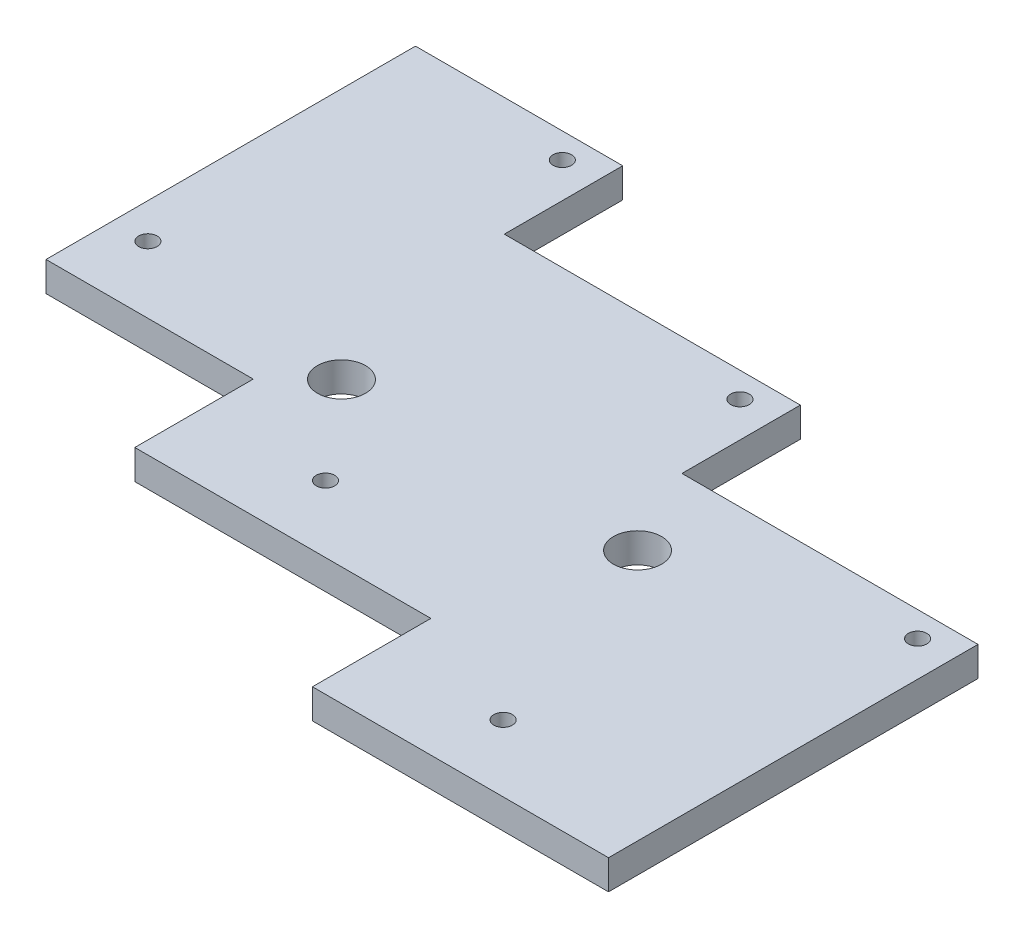
ISO-10303-21;
HEADER;
FILE_DESCRIPTION(('STEP AP214'),'2;1');
FILE_NAME('part.step','',(''),(''),'','','');
FILE_SCHEMA(('AUTOMOTIVE_DESIGN { 1 0 10303 214 1 1 1 1 }'));
ENDSEC;
DATA;
#1=APPLICATION_CONTEXT('core data for automotive mechanical design processes');
#2=APPLICATION_PROTOCOL_DEFINITION('international standard','automotive_design',2000,#1);
#3=PRODUCT_CONTEXT('',#1,'mechanical');
#4=PRODUCT('Part','Part','',(#3));
#5=PRODUCT_RELATED_PRODUCT_CATEGORY('part','',(#4));
#6=PRODUCT_DEFINITION_FORMATION('','',#4);
#7=PRODUCT_DEFINITION_CONTEXT('part definition',#1,'design');
#8=PRODUCT_DEFINITION('design','',#6,#7);
#9=PRODUCT_DEFINITION_SHAPE('','',#8);
#10=(LENGTH_UNIT() NAMED_UNIT(*) SI_UNIT(.MILLI.,.METRE.));
#11=(NAMED_UNIT(*) PLANE_ANGLE_UNIT() SI_UNIT($,.RADIAN.));
#12=(NAMED_UNIT(*) SI_UNIT($,.STERADIAN.) SOLID_ANGLE_UNIT());
#13=UNCERTAINTY_MEASURE_WITH_UNIT(LENGTH_MEASURE(1.E-05),#10,'distance_accuracy_value','');
#14=(GEOMETRIC_REPRESENTATION_CONTEXT(3) GLOBAL_UNCERTAINTY_ASSIGNED_CONTEXT((#13)) GLOBAL_UNIT_ASSIGNED_CONTEXT((#10,
#11,#12)) REPRESENTATION_CONTEXT('',''));
#15=CARTESIAN_POINT('',(0.,0.,0.));
#16=DIRECTION('',(0.,0.,1.));
#17=DIRECTION('',(1.,0.,0.));
#18=AXIS2_PLACEMENT_3D('',#15,#16,#17);
#19=CARTESIAN_POINT('',(-85.725,3.175,-65.024));
#20=DIRECTION('',(1.,0.,0.));
#21=DIRECTION('',(0.,0.,-1.));
#22=AXIS2_PLACEMENT_3D('',#19,#20,#21);
#23=PLANE('',#22);
#24=DIRECTION('',(0.,0.,1.));
#25=VECTOR('',#24,1.);
#26=CARTESIAN_POINT('',(-85.725,-3.175,-65.024));
#27=LINE('',#26,#25);
#28=CARTESIAN_POINT('',(-85.725,-3.175,-65.024));
#29=VERTEX_POINT('',#28);
#30=CARTESIAN_POINT('',(-85.725,-3.175,14.224));
#31=VERTEX_POINT('',#30);
#32=EDGE_CURVE('E165',#29,#31,#27,.T.);
#33=ORIENTED_EDGE('',*,*,#32,.T.);
#34=DIRECTION('',(0.,-1.,0.));
#35=VECTOR('',#34,1.);
#36=CARTESIAN_POINT('',(-85.725,3.175,14.224));
#37=LINE('',#36,#35);
#38=CARTESIAN_POINT('',(-85.725,3.175,14.224));
#39=VERTEX_POINT('',#38);
#40=EDGE_CURVE('E11',#39,#31,#37,.T.);
#41=ORIENTED_EDGE('',*,*,#40,.F.);
#42=DIRECTION('',(0.,0.,1.));
#43=VECTOR('',#42,1.);
#44=CARTESIAN_POINT('',(-85.725,3.175,-65.024));
#45=LINE('',#44,#43);
#46=CARTESIAN_POINT('',(-85.725,3.175,-65.024));
#47=VERTEX_POINT('',#46);
#48=EDGE_CURVE('E188',#47,#39,#45,.T.);
#49=ORIENTED_EDGE('',*,*,#48,.F.);
#50=DIRECTION('',(0.,-1.,0.));
#51=VECTOR('',#50,1.);
#52=CARTESIAN_POINT('',(-85.725,3.175,-65.024));
#53=LINE('',#52,#51);
#54=EDGE_CURVE('E161',#47,#29,#53,.T.);
#55=ORIENTED_EDGE('',*,*,#54,.T.);
#56=EDGE_LOOP('',(#33,#41,#49,#55));
#57=FACE_BOUND('',#56,.T.);
#58=ADVANCED_FACE('F45',(#57),#23,.F.);
#59=CARTESIAN_POINT('',(-85.725,3.175,14.224));
#60=DIRECTION('',(0.,0.,-1.));
#61=DIRECTION('',(-1.,0.,0.));
#62=AXIS2_PLACEMENT_3D('',#59,#60,#61);
#63=PLANE('',#62);
#64=DIRECTION('',(1.,0.,0.));
#65=VECTOR('',#64,1.);
#66=CARTESIAN_POINT('',(-85.725,-3.175,14.224));
#67=LINE('',#66,#65);
#68=CARTESIAN_POINT('',(-41.275,-3.175,14.224));
#69=VERTEX_POINT('',#68);
#70=EDGE_CURVE('E168',#31,#69,#67,.T.);
#71=ORIENTED_EDGE('',*,*,#70,.T.);
#72=DIRECTION('',(0.,-1.,0.));
#73=VECTOR('',#72,1.);
#74=CARTESIAN_POINT('',(-41.275,3.175,14.224));
#75=LINE('',#74,#73);
#76=CARTESIAN_POINT('',(-41.275,3.175,14.224));
#77=VERTEX_POINT('',#76);
#78=EDGE_CURVE('E53',#77,#69,#75,.T.);
#79=ORIENTED_EDGE('',*,*,#78,.F.);
#80=DIRECTION('',(1.,0.,0.));
#81=VECTOR('',#80,1.);
#82=CARTESIAN_POINT('',(-85.725,3.175,14.224));
#83=LINE('',#82,#81);
#84=EDGE_CURVE('E116',#39,#77,#83,.T.);
#85=ORIENTED_EDGE('',*,*,#84,.F.);
#86=ORIENTED_EDGE('',*,*,#40,.T.);
#87=EDGE_LOOP('',(#71,#79,#85,#86));
#88=FACE_BOUND('',#87,.T.);
#89=ADVANCED_FACE('F268',(#88),#63,.F.);
#90=CARTESIAN_POINT('',(-41.275,3.175,14.224));
#91=DIRECTION('',(1.,0.,0.));
#92=DIRECTION('',(0.,0.,-1.));
#93=AXIS2_PLACEMENT_3D('',#90,#91,#92);
#94=PLANE('',#93);
#95=DIRECTION('',(0.,0.,1.));
#96=VECTOR('',#95,1.);
#97=CARTESIAN_POINT('',(-41.275,-3.175,14.224));
#98=LINE('',#97,#96);
#99=CARTESIAN_POINT('',(-41.275,-3.175,39.624));
#100=VERTEX_POINT('',#99);
#101=EDGE_CURVE('E171',#69,#100,#98,.T.);
#102=ORIENTED_EDGE('',*,*,#101,.T.);
#103=DIRECTION('',(0.,-1.,0.));
#104=VECTOR('',#103,1.);
#105=CARTESIAN_POINT('',(-41.275,3.175,39.624));
#106=LINE('',#105,#104);
#107=CARTESIAN_POINT('',(-41.275,3.175,39.624));
#108=VERTEX_POINT('',#107);
#109=EDGE_CURVE('E207',#108,#100,#106,.T.);
#110=ORIENTED_EDGE('',*,*,#109,.F.);
#111=DIRECTION('',(0.,0.,1.));
#112=VECTOR('',#111,1.);
#113=CARTESIAN_POINT('',(-41.275,3.175,14.224));
#114=LINE('',#113,#112);
#115=EDGE_CURVE('E215',#77,#108,#114,.T.);
#116=ORIENTED_EDGE('',*,*,#115,.F.);
#117=ORIENTED_EDGE('',*,*,#78,.T.);
#118=EDGE_LOOP('',(#102,#110,#116,#117));
#119=FACE_BOUND('',#118,.T.);
#120=ADVANCED_FACE('F213',(#119),#94,.F.);
#121=CARTESIAN_POINT('',(-41.275,3.175,39.624));
#122=DIRECTION('',(0.,0.,-1.));
#123=DIRECTION('',(-1.,0.,0.));
#124=AXIS2_PLACEMENT_3D('',#121,#122,#123);
#125=PLANE('',#124);
#126=DIRECTION('',(1.,0.,0.));
#127=VECTOR('',#126,1.);
#128=CARTESIAN_POINT('',(-41.275,-3.175,39.624));
#129=LINE('',#128,#127);
#130=CARTESIAN_POINT('',(22.225,-3.175,39.624));
#131=VERTEX_POINT('',#130);
#132=EDGE_CURVE('E173',#100,#131,#129,.T.);
#133=ORIENTED_EDGE('',*,*,#132,.T.);
#134=DIRECTION('',(0.,-1.,0.));
#135=VECTOR('',#134,1.);
#136=CARTESIAN_POINT('',(22.225,3.175,39.624));
#137=LINE('',#136,#135);
#138=CARTESIAN_POINT('',(22.225,3.175,39.624));
#139=VERTEX_POINT('',#138);
#140=EDGE_CURVE('E204',#139,#131,#137,.T.);
#141=ORIENTED_EDGE('',*,*,#140,.F.);
#142=DIRECTION('',(1.,0.,0.));
#143=VECTOR('',#142,1.);
#144=CARTESIAN_POINT('',(-41.275,3.175,39.624));
#145=LINE('',#144,#143);
#146=EDGE_CURVE('E233',#108,#139,#145,.T.);
#147=ORIENTED_EDGE('',*,*,#146,.F.);
#148=ORIENTED_EDGE('',*,*,#109,.T.);
#149=EDGE_LOOP('',(#133,#141,#147,#148));
#150=FACE_BOUND('',#149,.T.);
#151=ADVANCED_FACE('F224',(#150),#125,.F.);
#152=CARTESIAN_POINT('',(22.225,3.175,39.624));
#153=DIRECTION('',(1.,0.,0.));
#154=DIRECTION('',(0.,0.,-1.));
#155=AXIS2_PLACEMENT_3D('',#152,#153,#154);
#156=PLANE('',#155);
#157=DIRECTION('',(0.,0.,1.));
#158=VECTOR('',#157,1.);
#159=CARTESIAN_POINT('',(22.225,-3.175,39.624));
#160=LINE('',#159,#158);
#161=CARTESIAN_POINT('',(22.225,-3.175,65.024));
#162=VERTEX_POINT('',#161);
#163=EDGE_CURVE('E175',#131,#162,#160,.T.);
#164=ORIENTED_EDGE('',*,*,#163,.T.);
#165=DIRECTION('',(0.,-1.,0.));
#166=VECTOR('',#165,1.);
#167=CARTESIAN_POINT('',(22.225,3.175,65.024));
#168=LINE('',#167,#166);
#169=CARTESIAN_POINT('',(22.225,3.175,65.024));
#170=VERTEX_POINT('',#169);
#171=EDGE_CURVE('E201',#170,#162,#168,.T.);
#172=ORIENTED_EDGE('',*,*,#171,.F.);
#173=DIRECTION('',(0.,0.,1.));
#174=VECTOR('',#173,1.);
#175=CARTESIAN_POINT('',(22.225,3.175,39.624));
#176=LINE('',#175,#174);
#177=EDGE_CURVE('E230',#139,#170,#176,.T.);
#178=ORIENTED_EDGE('',*,*,#177,.F.);
#179=ORIENTED_EDGE('',*,*,#140,.T.);
#180=EDGE_LOOP('',(#164,#172,#178,#179));
#181=FACE_BOUND('',#180,.T.);
#182=ADVANCED_FACE('F228',(#181),#156,.F.);
#183=CARTESIAN_POINT('',(22.225,3.175,65.024));
#184=DIRECTION('',(0.,0.,-1.));
#185=DIRECTION('',(-1.,0.,0.));
#186=AXIS2_PLACEMENT_3D('',#183,#184,#185);
#187=PLANE('',#186);
#188=DIRECTION('',(1.,0.,0.));
#189=VECTOR('',#188,1.);
#190=CARTESIAN_POINT('',(22.225,-3.175,65.024));
#191=LINE('',#190,#189);
#192=CARTESIAN_POINT('',(85.725,-3.175,65.024));
#193=VERTEX_POINT('',#192);
#194=EDGE_CURVE('E177',#162,#193,#191,.T.);
#195=ORIENTED_EDGE('',*,*,#194,.T.);
#196=DIRECTION('',(0.,-1.,0.));
#197=VECTOR('',#196,1.);
#198=CARTESIAN_POINT('',(85.725,3.175,65.024));
#199=LINE('',#198,#197);
#200=CARTESIAN_POINT('',(85.725,3.175,65.024));
#201=VERTEX_POINT('',#200);
#202=EDGE_CURVE('E198',#201,#193,#199,.T.);
#203=ORIENTED_EDGE('',*,*,#202,.F.);
#204=DIRECTION('',(1.,0.,0.));
#205=VECTOR('',#204,1.);
#206=CARTESIAN_POINT('',(22.225,3.175,65.024));
#207=LINE('',#206,#205);
#208=EDGE_CURVE('E232',#170,#201,#207,.T.);
#209=ORIENTED_EDGE('',*,*,#208,.F.);
#210=ORIENTED_EDGE('',*,*,#171,.T.);
#211=EDGE_LOOP('',(#195,#203,#209,#210));
#212=FACE_BOUND('',#211,.T.);
#213=ADVANCED_FACE('F281',(#212),#187,.F.);
#214=CARTESIAN_POINT('',(85.725,3.175,65.024));
#215=DIRECTION('',(-1.,0.,0.));
#216=DIRECTION('',(0.,0.,1.));
#217=AXIS2_PLACEMENT_3D('',#214,#215,#216);
#218=PLANE('',#217);
#219=DIRECTION('',(0.,0.,-1.));
#220=VECTOR('',#219,1.);
#221=CARTESIAN_POINT('',(85.725,-3.175,65.024));
#222=LINE('',#221,#220);
#223=CARTESIAN_POINT('',(85.725,-3.175,-14.224));
#224=VERTEX_POINT('',#223);
#225=EDGE_CURVE('E179',#193,#224,#222,.T.);
#226=ORIENTED_EDGE('',*,*,#225,.T.);
#227=DIRECTION('',(0.,-1.,0.));
#228=VECTOR('',#227,1.);
#229=CARTESIAN_POINT('',(85.725,3.175,-14.224));
#230=LINE('',#229,#228);
#231=CARTESIAN_POINT('',(85.725,3.175,-14.224));
#232=VERTEX_POINT('',#231);
#233=EDGE_CURVE('E195',#232,#224,#230,.T.);
#234=ORIENTED_EDGE('',*,*,#233,.F.);
#235=DIRECTION('',(0.,0.,-1.));
#236=VECTOR('',#235,1.);
#237=CARTESIAN_POINT('',(85.725,3.175,65.024));
#238=LINE('',#237,#236);
#239=EDGE_CURVE('E235',#201,#232,#238,.T.);
#240=ORIENTED_EDGE('',*,*,#239,.F.);
#241=ORIENTED_EDGE('',*,*,#202,.T.);
#242=EDGE_LOOP('',(#226,#234,#240,#241));
#243=FACE_BOUND('',#242,.T.);
#244=ADVANCED_FACE('F284',(#243),#218,.F.);
#245=CARTESIAN_POINT('',(85.725,3.175,-14.224));
#246=DIRECTION('',(0.,0.,1.));
#247=DIRECTION('',(1.,0.,0.));
#248=AXIS2_PLACEMENT_3D('',#245,#246,#247);
#249=PLANE('',#248);
#250=DIRECTION('',(-1.,0.,0.));
#251=VECTOR('',#250,1.);
#252=CARTESIAN_POINT('',(85.725,-3.175,-14.224));
#253=LINE('',#252,#251);
#254=CARTESIAN_POINT('',(22.225,-3.175,-14.224));
#255=VERTEX_POINT('',#254);
#256=EDGE_CURVE('E181',#224,#255,#253,.T.);
#257=ORIENTED_EDGE('',*,*,#256,.T.);
#258=DIRECTION('',(0.,-1.,0.));
#259=VECTOR('',#258,1.);
#260=CARTESIAN_POINT('',(22.225,3.175,-14.224));
#261=LINE('',#260,#259);
#262=CARTESIAN_POINT('',(22.225,3.175,-14.224));
#263=VERTEX_POINT('',#262);
#264=EDGE_CURVE('E192',#263,#255,#261,.T.);
#265=ORIENTED_EDGE('',*,*,#264,.F.);
#266=DIRECTION('',(-1.,0.,0.));
#267=VECTOR('',#266,1.);
#268=CARTESIAN_POINT('',(85.725,3.175,-14.224));
#269=LINE('',#268,#267);
#270=EDGE_CURVE('E241',#232,#263,#269,.T.);
#271=ORIENTED_EDGE('',*,*,#270,.F.);
#272=ORIENTED_EDGE('',*,*,#233,.T.);
#273=EDGE_LOOP('',(#257,#265,#271,#272));
#274=FACE_BOUND('',#273,.T.);
#275=ADVANCED_FACE('F247',(#274),#249,.F.);
#276=CARTESIAN_POINT('',(22.225,3.175,-14.224));
#277=DIRECTION('',(-1.,0.,0.));
#278=DIRECTION('',(0.,0.,1.));
#279=AXIS2_PLACEMENT_3D('',#276,#277,#278);
#280=PLANE('',#279);
#281=DIRECTION('',(0.,0.,-1.));
#282=VECTOR('',#281,1.);
#283=CARTESIAN_POINT('',(22.225,-3.175,-14.224));
#284=LINE('',#283,#282);
#285=CARTESIAN_POINT('',(22.225,-3.175,-39.624));
#286=VERTEX_POINT('',#285);
#287=EDGE_CURVE('E183',#255,#286,#284,.T.);
#288=ORIENTED_EDGE('',*,*,#287,.T.);
#289=DIRECTION('',(0.,-1.,0.));
#290=VECTOR('',#289,1.);
#291=CARTESIAN_POINT('',(22.225,3.175,-39.624));
#292=LINE('',#291,#290);
#293=CARTESIAN_POINT('',(22.225,3.175,-39.624));
#294=VERTEX_POINT('',#293);
#295=EDGE_CURVE('E156',#294,#286,#292,.T.);
#296=ORIENTED_EDGE('',*,*,#295,.F.);
#297=DIRECTION('',(0.,0.,-1.));
#298=VECTOR('',#297,1.);
#299=CARTESIAN_POINT('',(22.225,3.175,-14.224));
#300=LINE('',#299,#298);
#301=EDGE_CURVE('E147',#263,#294,#300,.T.);
#302=ORIENTED_EDGE('',*,*,#301,.F.);
#303=ORIENTED_EDGE('',*,*,#264,.T.);
#304=EDGE_LOOP('',(#288,#296,#302,#303));
#305=FACE_BOUND('',#304,.T.);
#306=ADVANCED_FACE('F251',(#305),#280,.F.);
#307=CARTESIAN_POINT('',(22.225,3.175,-39.624));
#308=DIRECTION('',(0.,0.,1.));
#309=DIRECTION('',(1.,0.,0.));
#310=AXIS2_PLACEMENT_3D('',#307,#308,#309);
#311=PLANE('',#310);
#312=DIRECTION('',(-1.,0.,0.));
#313=VECTOR('',#312,1.);
#314=CARTESIAN_POINT('',(22.225,-3.175,-39.624));
#315=LINE('',#314,#313);
#316=CARTESIAN_POINT('',(-41.275,-3.175,-39.624));
#317=VERTEX_POINT('',#316);
#318=EDGE_CURVE('E155',#286,#317,#315,.T.);
#319=ORIENTED_EDGE('',*,*,#318,.T.);
#320=DIRECTION('',(0.,-1.,0.));
#321=VECTOR('',#320,1.);
#322=CARTESIAN_POINT('',(-41.275,3.175,-39.624));
#323=LINE('',#322,#321);
#324=CARTESIAN_POINT('',(-41.275,3.175,-39.624));
#325=VERTEX_POINT('',#324);
#326=EDGE_CURVE('E152',#325,#317,#323,.T.);
#327=ORIENTED_EDGE('',*,*,#326,.F.);
#328=DIRECTION('',(-1.,0.,0.));
#329=VECTOR('',#328,1.);
#330=CARTESIAN_POINT('',(22.225,3.175,-39.624));
#331=LINE('',#330,#329);
#332=EDGE_CURVE('E141',#294,#325,#331,.T.);
#333=ORIENTED_EDGE('',*,*,#332,.F.);
#334=ORIENTED_EDGE('',*,*,#295,.T.);
#335=EDGE_LOOP('',(#319,#327,#333,#334));
#336=FACE_BOUND('',#335,.T.);
#337=ADVANCED_FACE('F153',(#336),#311,.F.);
#338=CARTESIAN_POINT('',(-41.275,3.175,-39.624));
#339=DIRECTION('',(-1.,0.,0.));
#340=DIRECTION('',(0.,0.,1.));
#341=AXIS2_PLACEMENT_3D('',#338,#339,#340);
#342=PLANE('',#341);
#343=DIRECTION('',(0.,0.,-1.));
#344=VECTOR('',#343,1.);
#345=CARTESIAN_POINT('',(-41.275,-3.175,-39.624));
#346=LINE('',#345,#344);
#347=CARTESIAN_POINT('',(-41.275,-3.175,-65.024));
#348=VERTEX_POINT('',#347);
#349=EDGE_CURVE('E102',#317,#348,#346,.T.);
#350=ORIENTED_EDGE('',*,*,#349,.T.);
#351=DIRECTION('',(0.,-1.,0.));
#352=VECTOR('',#351,1.);
#353=CARTESIAN_POINT('',(-41.275,3.175,-65.024));
#354=LINE('',#353,#352);
#355=CARTESIAN_POINT('',(-41.275,3.175,-65.024));
#356=VERTEX_POINT('',#355);
#357=EDGE_CURVE('E157',#356,#348,#354,.T.);
#358=ORIENTED_EDGE('',*,*,#357,.F.);
#359=DIRECTION('',(0.,0.,-1.));
#360=VECTOR('',#359,1.);
#361=CARTESIAN_POINT('',(-41.275,3.175,-39.624));
#362=LINE('',#361,#360);
#363=EDGE_CURVE('E145',#325,#356,#362,.T.);
#364=ORIENTED_EDGE('',*,*,#363,.F.);
#365=ORIENTED_EDGE('',*,*,#326,.T.);
#366=EDGE_LOOP('',(#350,#358,#364,#365));
#367=FACE_BOUND('',#366,.T.);
#368=ADVANCED_FACE('F159',(#367),#342,.F.);
#369=CARTESIAN_POINT('',(-41.275,3.175,-65.024));
#370=DIRECTION('',(0.,0.,1.));
#371=DIRECTION('',(1.,0.,0.));
#372=AXIS2_PLACEMENT_3D('',#369,#370,#371);
#373=PLANE('',#372);
#374=DIRECTION('',(-1.,0.,0.));
#375=VECTOR('',#374,1.);
#376=CARTESIAN_POINT('',(-41.275,-3.175,-65.024));
#377=LINE('',#376,#375);
#378=EDGE_CURVE('E108',#348,#29,#377,.T.);
#379=ORIENTED_EDGE('',*,*,#378,.T.);
#380=ORIENTED_EDGE('',*,*,#54,.F.);
#381=DIRECTION('',(-1.,0.,0.));
#382=VECTOR('',#381,1.);
#383=CARTESIAN_POINT('',(-41.275,3.175,-65.024));
#384=LINE('',#383,#382);
#385=EDGE_CURVE('E61',#356,#47,#384,.T.);
#386=ORIENTED_EDGE('',*,*,#385,.F.);
#387=ORIENTED_EDGE('',*,*,#357,.T.);
#388=EDGE_LOOP('',(#379,#380,#386,#387));
#389=FACE_BOUND('',#388,.T.);
#390=ADVANCED_FACE('F255',(#389),#373,.F.);
#391=CARTESIAN_POINT('',(0.,3.175,0.));
#392=DIRECTION('',(0.,1.,0.));
#393=DIRECTION('',(0.,0.,1.));
#394=AXIS2_PLACEMENT_3D('',#391,#392,#393);
#395=PLANE('',#394);
#396=CARTESIAN_POINT('',(-78.1812,3.175,-0.0762000000000029));
#397=DIRECTION('',(0.,1.,0.));
#398=DIRECTION('',(0.,0.,1.));
#399=AXIS2_PLACEMENT_3D('',#396,#397,#398);
#400=CIRCLE('',#399,1.98119999999999);
#401=CARTESIAN_POINT('',(-78.1812,3.175,1.90499999999999));
#402=VERTEX_POINT('',#401);
#403=EDGE_CURVE('E458',#402,#402,#400,.T.);
#404=ORIENTED_EDGE('',*,*,#403,.F.);
#405=EDGE_LOOP('',(#404));
#406=FACE_BOUND('',#405,.T.);
#407=CARTESIAN_POINT('',(-48.8188,3.175,-59.6138));
#408=DIRECTION('',(0.,1.,0.));
#409=DIRECTION('',(0.,0.,1.));
#410=AXIS2_PLACEMENT_3D('',#407,#408,#409);
#411=CIRCLE('',#410,1.98119999999999);
#412=CARTESIAN_POINT('',(-48.8188,3.175,-57.6326));
#413=VERTEX_POINT('',#412);
#414=EDGE_CURVE('E460',#413,#413,#411,.T.);
#415=ORIENTED_EDGE('',*,*,#414,.F.);
#416=EDGE_LOOP('',(#415));
#417=FACE_BOUND('',#416,.T.);
#418=CARTESIAN_POINT('',(-14.6812,3.175,25.3238));
#419=DIRECTION('',(0.,1.,0.));
#420=DIRECTION('',(0.,0.,1.));
#421=AXIS2_PLACEMENT_3D('',#418,#419,#420);
#422=CIRCLE('',#421,1.98119999999999);
#423=CARTESIAN_POINT('',(-14.6812,3.175,27.305));
#424=VERTEX_POINT('',#423);
#425=EDGE_CURVE('E468',#424,#424,#422,.T.);
#426=ORIENTED_EDGE('',*,*,#425,.F.);
#427=EDGE_LOOP('',(#426));
#428=FACE_BOUND('',#427,.T.);
#429=CARTESIAN_POINT('',(14.6812,3.175,-34.2138));
#430=DIRECTION('',(0.,1.,0.));
#431=DIRECTION('',(0.,0.,1.));
#432=AXIS2_PLACEMENT_3D('',#429,#430,#431);
#433=CIRCLE('',#432,1.98119999999999);
#434=CARTESIAN_POINT('',(14.6812,3.175,-32.2326));
#435=VERTEX_POINT('',#434);
#436=EDGE_CURVE('E474',#435,#435,#433,.T.);
#437=ORIENTED_EDGE('',*,*,#436,.F.);
#438=EDGE_LOOP('',(#437));
#439=FACE_BOUND('',#438,.T.);
#440=CARTESIAN_POINT('',(48.8188,3.175,50.7238));
#441=DIRECTION('',(0.,1.,0.));
#442=DIRECTION('',(0.,0.,1.));
#443=AXIS2_PLACEMENT_3D('',#440,#441,#442);
#444=CIRCLE('',#443,1.98119999999999);
#445=CARTESIAN_POINT('',(48.8188,3.175,52.705));
#446=VERTEX_POINT('',#445);
#447=EDGE_CURVE('E480',#446,#446,#444,.T.);
#448=ORIENTED_EDGE('',*,*,#447,.F.);
#449=EDGE_LOOP('',(#448));
#450=FACE_BOUND('',#449,.T.);
#451=CARTESIAN_POINT('',(78.1812,3.175,-8.8138));
#452=DIRECTION('',(0.,1.,0.));
#453=DIRECTION('',(0.,0.,1.));
#454=AXIS2_PLACEMENT_3D('',#451,#452,#453);
#455=CIRCLE('',#454,1.98119999999999);
#456=CARTESIAN_POINT('',(78.1812,3.175,-6.83260000000001));
#457=VERTEX_POINT('',#456);
#458=EDGE_CURVE('E486',#457,#457,#455,.T.);
#459=ORIENTED_EDGE('',*,*,#458,.F.);
#460=EDGE_LOOP('',(#459));
#461=FACE_BOUND('',#460,.T.);
#462=CARTESIAN_POINT('',(-31.75,3.175,4.826));
#463=DIRECTION('',(0.,1.,0.));
#464=DIRECTION('',(0.,0.,1.));
#465=AXIS2_PLACEMENT_3D('',#462,#463,#464);
#466=CIRCLE('',#465,5.1562);
#467=CARTESIAN_POINT('',(-31.75,3.175,9.9822));
#468=VERTEX_POINT('',#467);
#469=EDGE_CURVE('E495',#468,#468,#466,.T.);
#470=ORIENTED_EDGE('',*,*,#469,.F.);
#471=EDGE_LOOP('',(#470));
#472=FACE_BOUND('',#471,.T.);
#473=CARTESIAN_POINT('',(31.75,3.175,4.826));
#474=DIRECTION('',(0.,1.,0.));
#475=DIRECTION('',(0.,0.,1.));
#476=AXIS2_PLACEMENT_3D('',#473,#474,#475);
#477=CIRCLE('',#476,5.1562);
#478=CARTESIAN_POINT('',(31.75,3.175,9.9822));
#479=VERTEX_POINT('',#478);
#480=EDGE_CURVE('E498',#479,#479,#477,.T.);
#481=ORIENTED_EDGE('',*,*,#480,.F.);
#482=EDGE_LOOP('',(#481));
#483=FACE_BOUND('',#482,.T.);
#484=ORIENTED_EDGE('',*,*,#48,.T.);
#485=ORIENTED_EDGE('',*,*,#84,.T.);
#486=ORIENTED_EDGE('',*,*,#115,.T.);
#487=ORIENTED_EDGE('',*,*,#146,.T.);
#488=ORIENTED_EDGE('',*,*,#177,.T.);
#489=ORIENTED_EDGE('',*,*,#208,.T.);
#490=ORIENTED_EDGE('',*,*,#239,.T.);
#491=ORIENTED_EDGE('',*,*,#270,.T.);
#492=ORIENTED_EDGE('',*,*,#301,.T.);
#493=ORIENTED_EDGE('',*,*,#332,.T.);
#494=ORIENTED_EDGE('',*,*,#363,.T.);
#495=ORIENTED_EDGE('',*,*,#385,.T.);
#496=EDGE_LOOP('',(#484,#485,#486,#487,#488,#489,#490,#491,#492,#493,#494,#495));
#497=FACE_BOUND('',#496,.T.);
#498=ADVANCED_FACE('F143',(#406,#417,#428,#439,#450,#461,#472,#483,#497),#395,.T.);
#499=CARTESIAN_POINT('',(0.,-3.175,0.));
#500=DIRECTION('',(0.,1.,0.));
#501=DIRECTION('',(0.,0.,1.));
#502=AXIS2_PLACEMENT_3D('',#499,#500,#501);
#503=PLANE('',#502);
#504=CARTESIAN_POINT('',(-78.1812,-3.17499999999999,-0.0762000000000029));
#505=DIRECTION('',(0.,1.,0.));
#506=DIRECTION('',(0.,0.,1.));
#507=AXIS2_PLACEMENT_3D('',#504,#505,#506);
#508=CIRCLE('',#507,1.98119999999999);
#509=CARTESIAN_POINT('',(-78.1812,-3.17499999999999,1.90499999999999));
#510=VERTEX_POINT('',#509);
#511=EDGE_CURVE('E455',#510,#510,#508,.T.);
#512=ORIENTED_EDGE('',*,*,#511,.T.);
#513=EDGE_LOOP('',(#512));
#514=FACE_BOUND('',#513,.T.);
#515=CARTESIAN_POINT('',(-48.8188,-3.17499999999999,-59.6138));
#516=DIRECTION('',(0.,1.,0.));
#517=DIRECTION('',(0.,0.,1.));
#518=AXIS2_PLACEMENT_3D('',#515,#516,#517);
#519=CIRCLE('',#518,1.98119999999999);
#520=CARTESIAN_POINT('',(-48.8188,-3.17499999999999,-57.6326));
#521=VERTEX_POINT('',#520);
#522=EDGE_CURVE('E465',#521,#521,#519,.T.);
#523=ORIENTED_EDGE('',*,*,#522,.T.);
#524=EDGE_LOOP('',(#523));
#525=FACE_BOUND('',#524,.T.);
#526=CARTESIAN_POINT('',(-14.6812,-3.17499999999999,25.3238));
#527=DIRECTION('',(0.,1.,0.));
#528=DIRECTION('',(0.,0.,1.));
#529=AXIS2_PLACEMENT_3D('',#526,#527,#528);
#530=CIRCLE('',#529,1.98119999999999);
#531=CARTESIAN_POINT('',(-14.6812,-3.17499999999999,27.305));
#532=VERTEX_POINT('',#531);
#533=EDGE_CURVE('E471',#532,#532,#530,.T.);
#534=ORIENTED_EDGE('',*,*,#533,.T.);
#535=EDGE_LOOP('',(#534));
#536=FACE_BOUND('',#535,.T.);
#537=CARTESIAN_POINT('',(14.6812,-3.17499999999999,-34.2138));
#538=DIRECTION('',(0.,1.,0.));
#539=DIRECTION('',(0.,0.,1.));
#540=AXIS2_PLACEMENT_3D('',#537,#538,#539);
#541=CIRCLE('',#540,1.98119999999999);
#542=CARTESIAN_POINT('',(14.6812,-3.17499999999999,-32.2326));
#543=VERTEX_POINT('',#542);
#544=EDGE_CURVE('E477',#543,#543,#541,.T.);
#545=ORIENTED_EDGE('',*,*,#544,.T.);
#546=EDGE_LOOP('',(#545));
#547=FACE_BOUND('',#546,.T.);
#548=CARTESIAN_POINT('',(48.8188,-3.17499999999999,50.7238));
#549=DIRECTION('',(0.,1.,0.));
#550=DIRECTION('',(0.,0.,1.));
#551=AXIS2_PLACEMENT_3D('',#548,#549,#550);
#552=CIRCLE('',#551,1.98119999999999);
#553=CARTESIAN_POINT('',(48.8188,-3.17499999999999,52.705));
#554=VERTEX_POINT('',#553);
#555=EDGE_CURVE('E483',#554,#554,#552,.T.);
#556=ORIENTED_EDGE('',*,*,#555,.T.);
#557=EDGE_LOOP('',(#556));
#558=FACE_BOUND('',#557,.T.);
#559=CARTESIAN_POINT('',(78.1812,-3.17499999999999,-8.8138));
#560=DIRECTION('',(0.,1.,0.));
#561=DIRECTION('',(0.,0.,1.));
#562=AXIS2_PLACEMENT_3D('',#559,#560,#561);
#563=CIRCLE('',#562,1.98119999999999);
#564=CARTESIAN_POINT('',(78.1812,-3.17499999999999,-6.83260000000001));
#565=VERTEX_POINT('',#564);
#566=EDGE_CURVE('E489',#565,#565,#563,.T.);
#567=ORIENTED_EDGE('',*,*,#566,.T.);
#568=EDGE_LOOP('',(#567));
#569=FACE_BOUND('',#568,.T.);
#570=CARTESIAN_POINT('',(-31.75,-3.175,4.826));
#571=DIRECTION('',(0.,1.,0.));
#572=DIRECTION('',(0.,0.,1.));
#573=AXIS2_PLACEMENT_3D('',#570,#571,#572);
#574=CIRCLE('',#573,5.1562);
#575=CARTESIAN_POINT('',(-31.75,-3.175,9.9822));
#576=VERTEX_POINT('',#575);
#577=EDGE_CURVE('E169',#576,#576,#574,.T.);
#578=ORIENTED_EDGE('',*,*,#577,.T.);
#579=EDGE_LOOP('',(#578));
#580=FACE_BOUND('',#579,.T.);
#581=CARTESIAN_POINT('',(31.75,-3.175,4.826));
#582=DIRECTION('',(0.,1.,0.));
#583=DIRECTION('',(0.,0.,1.));
#584=AXIS2_PLACEMENT_3D('',#581,#582,#583);
#585=CIRCLE('',#584,5.1562);
#586=CARTESIAN_POINT('',(31.75,-3.175,9.9822));
#587=VERTEX_POINT('',#586);
#588=EDGE_CURVE('E492',#587,#587,#585,.T.);
#589=ORIENTED_EDGE('',*,*,#588,.T.);
#590=EDGE_LOOP('',(#589));
#591=FACE_BOUND('',#590,.T.);
#592=ORIENTED_EDGE('',*,*,#32,.F.);
#593=ORIENTED_EDGE('',*,*,#378,.F.);
#594=ORIENTED_EDGE('',*,*,#349,.F.);
#595=ORIENTED_EDGE('',*,*,#318,.F.);
#596=ORIENTED_EDGE('',*,*,#287,.F.);
#597=ORIENTED_EDGE('',*,*,#256,.F.);
#598=ORIENTED_EDGE('',*,*,#225,.F.);
#599=ORIENTED_EDGE('',*,*,#194,.F.);
#600=ORIENTED_EDGE('',*,*,#163,.F.);
#601=ORIENTED_EDGE('',*,*,#132,.F.);
#602=ORIENTED_EDGE('',*,*,#101,.F.);
#603=ORIENTED_EDGE('',*,*,#70,.F.);
#604=EDGE_LOOP('',(#592,#593,#594,#595,#596,#597,#598,#599,#600,#601,#602,#603));
#605=FACE_BOUND('',#604,.T.);
#606=ADVANCED_FACE('F219',(#514,#525,#536,#547,#558,#569,#580,#591,#605),#503,.F.);
#607=CARTESIAN_POINT('',(31.75,-3.175,4.826));
#608=DIRECTION('',(0.,1.,0.));
#609=DIRECTION('',(0.,0.,1.));
#610=AXIS2_PLACEMENT_3D('',#607,#608,#609);
#611=CYLINDRICAL_SURFACE('',#610,5.1562);
#612=ORIENTED_EDGE('',*,*,#588,.F.);
#613=EDGE_LOOP('',(#612));
#614=FACE_BOUND('',#613,.T.);
#615=ORIENTED_EDGE('',*,*,#480,.T.);
#616=EDGE_LOOP('',(#615));
#617=FACE_BOUND('',#616,.T.);
#618=ADVANCED_FACE('F326',(#614,#617),#611,.F.);
#619=CARTESIAN_POINT('',(-31.75,-3.175,4.826));
#620=DIRECTION('',(0.,1.,0.));
#621=DIRECTION('',(0.,0.,1.));
#622=AXIS2_PLACEMENT_3D('',#619,#620,#621);
#623=CYLINDRICAL_SURFACE('',#622,5.1562);
#624=ORIENTED_EDGE('',*,*,#577,.F.);
#625=EDGE_LOOP('',(#624));
#626=FACE_BOUND('',#625,.T.);
#627=ORIENTED_EDGE('',*,*,#469,.T.);
#628=EDGE_LOOP('',(#627));
#629=FACE_BOUND('',#628,.T.);
#630=ADVANCED_FACE('F335',(#626,#629),#623,.F.);
#631=CARTESIAN_POINT('',(78.1812,3.175,-8.8138));
#632=DIRECTION('',(0.,1.,0.));
#633=DIRECTION('',(0.,0.,1.));
#634=AXIS2_PLACEMENT_3D('',#631,#632,#633);
#635=CYLINDRICAL_SURFACE('',#634,1.98119999999999);
#636=ORIENTED_EDGE('',*,*,#566,.F.);
#637=EDGE_LOOP('',(#636));
#638=FACE_BOUND('',#637,.T.);
#639=ORIENTED_EDGE('',*,*,#458,.T.);
#640=EDGE_LOOP('',(#639));
#641=FACE_BOUND('',#640,.T.);
#642=ADVANCED_FACE('F344',(#638,#641),#635,.F.);
#643=CARTESIAN_POINT('',(48.8188,3.175,50.7238));
#644=DIRECTION('',(0.,1.,0.));
#645=DIRECTION('',(0.,0.,1.));
#646=AXIS2_PLACEMENT_3D('',#643,#644,#645);
#647=CYLINDRICAL_SURFACE('',#646,1.98119999999999);
#648=ORIENTED_EDGE('',*,*,#555,.F.);
#649=EDGE_LOOP('',(#648));
#650=FACE_BOUND('',#649,.T.);
#651=ORIENTED_EDGE('',*,*,#447,.T.);
#652=EDGE_LOOP('',(#651));
#653=FACE_BOUND('',#652,.T.);
#654=ADVANCED_FACE('F354',(#650,#653),#647,.F.);
#655=CARTESIAN_POINT('',(14.6812,3.175,-34.2138));
#656=DIRECTION('',(0.,1.,0.));
#657=DIRECTION('',(0.,0.,1.));
#658=AXIS2_PLACEMENT_3D('',#655,#656,#657);
#659=CYLINDRICAL_SURFACE('',#658,1.98119999999999);
#660=ORIENTED_EDGE('',*,*,#544,.F.);
#661=EDGE_LOOP('',(#660));
#662=FACE_BOUND('',#661,.T.);
#663=ORIENTED_EDGE('',*,*,#436,.T.);
#664=EDGE_LOOP('',(#663));
#665=FACE_BOUND('',#664,.T.);
#666=ADVANCED_FACE('F366',(#662,#665),#659,.F.);
#667=CARTESIAN_POINT('',(-14.6812,3.175,25.3238));
#668=DIRECTION('',(0.,1.,0.));
#669=DIRECTION('',(0.,0.,1.));
#670=AXIS2_PLACEMENT_3D('',#667,#668,#669);
#671=CYLINDRICAL_SURFACE('',#670,1.98119999999999);
#672=ORIENTED_EDGE('',*,*,#533,.F.);
#673=EDGE_LOOP('',(#672));
#674=FACE_BOUND('',#673,.T.);
#675=ORIENTED_EDGE('',*,*,#425,.T.);
#676=EDGE_LOOP('',(#675));
#677=FACE_BOUND('',#676,.T.);
#678=ADVANCED_FACE('F378',(#674,#677),#671,.F.);
#679=CARTESIAN_POINT('',(-48.8188,3.175,-59.6138));
#680=DIRECTION('',(0.,1.,0.));
#681=DIRECTION('',(0.,0.,1.));
#682=AXIS2_PLACEMENT_3D('',#679,#680,#681);
#683=CYLINDRICAL_SURFACE('',#682,1.98119999999999);
#684=ORIENTED_EDGE('',*,*,#522,.F.);
#685=EDGE_LOOP('',(#684));
#686=FACE_BOUND('',#685,.T.);
#687=ORIENTED_EDGE('',*,*,#414,.T.);
#688=EDGE_LOOP('',(#687));
#689=FACE_BOUND('',#688,.T.);
#690=ADVANCED_FACE('F390',(#686,#689),#683,.F.);
#691=CARTESIAN_POINT('',(-78.1812,3.175,-0.0762000000000029));
#692=DIRECTION('',(0.,1.,0.));
#693=DIRECTION('',(0.,0.,1.));
#694=AXIS2_PLACEMENT_3D('',#691,#692,#693);
#695=CYLINDRICAL_SURFACE('',#694,1.98119999999999);
#696=ORIENTED_EDGE('',*,*,#511,.F.);
#697=EDGE_LOOP('',(#696));
#698=FACE_BOUND('',#697,.T.);
#699=ORIENTED_EDGE('',*,*,#403,.T.);
#700=EDGE_LOOP('',(#699));
#701=FACE_BOUND('',#700,.T.);
#702=ADVANCED_FACE('F402',(#698,#701),#695,.F.);
#703=CLOSED_SHELL('',(#58,#89,#120,#151,#182,#213,#244,#275,#306,#337,#368,#390,#498,#606,#618,
#630,#642,#654,#666,#678,#690,#702));
#704=MANIFOLD_SOLID_BREP('B2',#703);
#705=ADVANCED_BREP_SHAPE_REPRESENTATION('',(#18,#704),#14);
#706=SHAPE_DEFINITION_REPRESENTATION(#9,#705);
ENDSEC;
END-ISO-10303-21;
